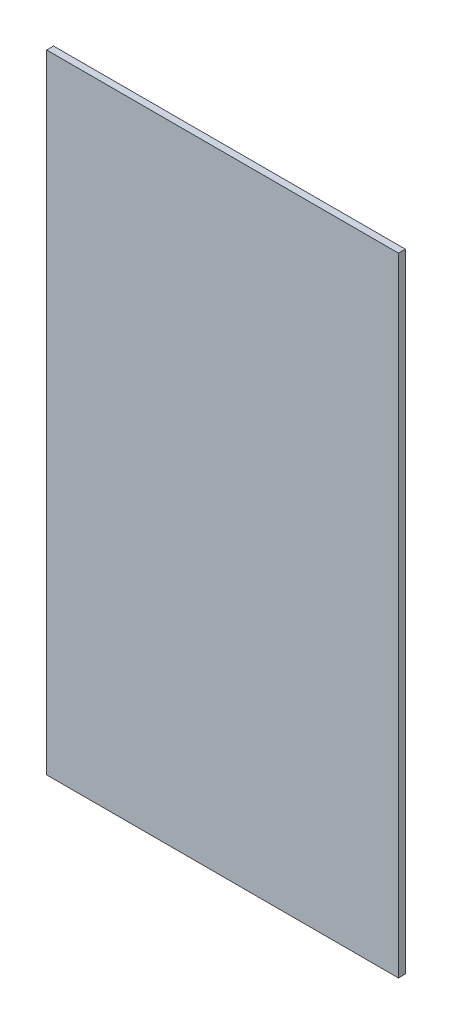
ISO-10303-21;
HEADER;
FILE_DESCRIPTION(('STEP AP214'),'2;1');
FILE_NAME('part.step','',(''),(''),'','','');
FILE_SCHEMA(('AUTOMOTIVE_DESIGN { 1 0 10303 214 1 1 1 1 }'));
ENDSEC;
DATA;
#1=APPLICATION_CONTEXT('core data for automotive mechanical design processes');
#2=APPLICATION_PROTOCOL_DEFINITION('international standard','automotive_design',2000,#1);
#3=PRODUCT_CONTEXT('',#1,'mechanical');
#4=PRODUCT('Part','Part','',(#3));
#5=PRODUCT_RELATED_PRODUCT_CATEGORY('part','',(#4));
#6=PRODUCT_DEFINITION_FORMATION('','',#4);
#7=PRODUCT_DEFINITION_CONTEXT('part definition',#1,'design');
#8=PRODUCT_DEFINITION('design','',#6,#7);
#9=PRODUCT_DEFINITION_SHAPE('','',#8);
#10=(LENGTH_UNIT() NAMED_UNIT(*) SI_UNIT(.MILLI.,.METRE.));
#11=(NAMED_UNIT(*) PLANE_ANGLE_UNIT() SI_UNIT($,.RADIAN.));
#12=(NAMED_UNIT(*) SI_UNIT($,.STERADIAN.) SOLID_ANGLE_UNIT());
#13=UNCERTAINTY_MEASURE_WITH_UNIT(LENGTH_MEASURE(1.E-05),#10,'distance_accuracy_value','');
#14=(GEOMETRIC_REPRESENTATION_CONTEXT(3) GLOBAL_UNCERTAINTY_ASSIGNED_CONTEXT((#13)) GLOBAL_UNIT_ASSIGNED_CONTEXT((#10,
#11,#12)) REPRESENTATION_CONTEXT('',''));
#15=CARTESIAN_POINT('',(0.,0.,0.));
#16=DIRECTION('',(0.,0.,1.));
#17=DIRECTION('',(1.,0.,0.));
#18=AXIS2_PLACEMENT_3D('',#15,#16,#17);
#19=CARTESIAN_POINT('',(22.5000000000001,22.5,-5.));
#20=DIRECTION('',(0.,-1.,0.));
#21=DIRECTION('',(1.,0.,0.));
#22=AXIS2_PLACEMENT_3D('',#19,#20,#21);
#23=PLANE('',#22);
#24=DIRECTION('',(1.,0.,0.));
#25=VECTOR('',#24,1.);
#26=CARTESIAN_POINT('',(22.5000000000001,22.5,0.));
#27=LINE('',#26,#25);
#28=CARTESIAN_POINT('',(22.5000000000001,22.5,0.));
#29=VERTEX_POINT('',#28);
#30=CARTESIAN_POINT('',(277.5,22.5000000000001,0.));
#31=VERTEX_POINT('',#30);
#32=EDGE_CURVE('E97',#29,#31,#27,.T.);
#33=ORIENTED_EDGE('',*,*,#32,.F.);
#34=DIRECTION('',(0.,0.,1.));
#35=VECTOR('',#34,1.);
#36=CARTESIAN_POINT('',(22.5000000000001,22.5,-5.));
#37=LINE('',#36,#35);
#38=CARTESIAN_POINT('',(22.5000000000001,22.5,-5.));
#39=VERTEX_POINT('',#38);
#40=EDGE_CURVE('E11',#39,#29,#37,.T.);
#41=ORIENTED_EDGE('',*,*,#40,.F.);
#42=DIRECTION('',(1.,0.,0.));
#43=VECTOR('',#42,1.);
#44=CARTESIAN_POINT('',(22.5000000000001,22.5,-5.));
#45=LINE('',#44,#43);
#46=CARTESIAN_POINT('',(277.5,22.5000000000001,-5.));
#47=VERTEX_POINT('',#46);
#48=EDGE_CURVE('E91',#39,#47,#45,.T.);
#49=ORIENTED_EDGE('',*,*,#48,.T.);
#50=DIRECTION('',(0.,0.,1.));
#51=VECTOR('',#50,1.);
#52=CARTESIAN_POINT('',(277.5,22.5000000000001,-5.));
#53=LINE('',#52,#51);
#54=EDGE_CURVE('E36',#47,#31,#53,.T.);
#55=ORIENTED_EDGE('',*,*,#54,.T.);
#56=EDGE_LOOP('',(#33,#41,#49,#55));
#57=FACE_BOUND('',#56,.T.);
#58=ADVANCED_FACE('F33',(#57),#23,.T.);
#59=CARTESIAN_POINT('',(22.5,477.5,-5.));
#60=DIRECTION('',(-1.,0.,0.));
#61=DIRECTION('',(0.,-1.,0.));
#62=AXIS2_PLACEMENT_3D('',#59,#60,#61);
#63=PLANE('',#62);
#64=DIRECTION('',(0.,-1.,0.));
#65=VECTOR('',#64,1.);
#66=CARTESIAN_POINT('',(22.5,477.5,0.));
#67=LINE('',#66,#65);
#68=CARTESIAN_POINT('',(22.5,477.5,0.));
#69=VERTEX_POINT('',#68);
#70=EDGE_CURVE('E93',#69,#29,#67,.T.);
#71=ORIENTED_EDGE('',*,*,#70,.F.);
#72=DIRECTION('',(0.,0.,1.));
#73=VECTOR('',#72,1.);
#74=CARTESIAN_POINT('',(22.5,477.5,-5.));
#75=LINE('',#74,#73);
#76=CARTESIAN_POINT('',(22.5,477.5,-5.));
#77=VERTEX_POINT('',#76);
#78=EDGE_CURVE('E42',#77,#69,#75,.T.);
#79=ORIENTED_EDGE('',*,*,#78,.F.);
#80=DIRECTION('',(0.,-1.,0.));
#81=VECTOR('',#80,1.);
#82=CARTESIAN_POINT('',(22.5,477.5,-5.));
#83=LINE('',#82,#81);
#84=EDGE_CURVE('E88',#77,#39,#83,.T.);
#85=ORIENTED_EDGE('',*,*,#84,.T.);
#86=ORIENTED_EDGE('',*,*,#40,.T.);
#87=EDGE_LOOP('',(#71,#79,#85,#86));
#88=FACE_BOUND('',#87,.T.);
#89=ADVANCED_FACE('F107',(#88),#63,.T.);
#90=CARTESIAN_POINT('',(277.5,477.5,-5.));
#91=DIRECTION('',(0.,1.,0.));
#92=DIRECTION('',(-1.,0.,0.));
#93=AXIS2_PLACEMENT_3D('',#90,#91,#92);
#94=PLANE('',#93);
#95=DIRECTION('',(-1.,0.,0.));
#96=VECTOR('',#95,1.);
#97=CARTESIAN_POINT('',(277.5,477.5,0.));
#98=LINE('',#97,#96);
#99=CARTESIAN_POINT('',(277.5,477.5,0.));
#100=VERTEX_POINT('',#99);
#101=EDGE_CURVE('E83',#100,#69,#98,.T.);
#102=ORIENTED_EDGE('',*,*,#101,.F.);
#103=DIRECTION('',(0.,0.,1.));
#104=VECTOR('',#103,1.);
#105=CARTESIAN_POINT('',(277.5,477.5,-5.));
#106=LINE('',#105,#104);
#107=CARTESIAN_POINT('',(277.5,477.5,-5.));
#108=VERTEX_POINT('',#107);
#109=EDGE_CURVE('E78',#108,#100,#106,.T.);
#110=ORIENTED_EDGE('',*,*,#109,.F.);
#111=DIRECTION('',(-1.,0.,0.));
#112=VECTOR('',#111,1.);
#113=CARTESIAN_POINT('',(277.5,477.5,-5.));
#114=LINE('',#113,#112);
#115=EDGE_CURVE('E81',#108,#77,#114,.T.);
#116=ORIENTED_EDGE('',*,*,#115,.T.);
#117=ORIENTED_EDGE('',*,*,#78,.T.);
#118=EDGE_LOOP('',(#102,#110,#116,#117));
#119=FACE_BOUND('',#118,.T.);
#120=ADVANCED_FACE('F80',(#119),#94,.T.);
#121=CARTESIAN_POINT('',(277.5,22.5000000000001,-5.));
#122=DIRECTION('',(1.,0.,0.));
#123=DIRECTION('',(0.,1.,0.));
#124=AXIS2_PLACEMENT_3D('',#121,#122,#123);
#125=PLANE('',#124);
#126=DIRECTION('',(0.,1.,0.));
#127=VECTOR('',#126,1.);
#128=CARTESIAN_POINT('',(277.5,22.5000000000001,0.));
#129=LINE('',#128,#127);
#130=EDGE_CURVE('E100',#31,#100,#129,.T.);
#131=ORIENTED_EDGE('',*,*,#130,.F.);
#132=ORIENTED_EDGE('',*,*,#54,.F.);
#133=DIRECTION('',(0.,1.,0.));
#134=VECTOR('',#133,1.);
#135=CARTESIAN_POINT('',(277.5,22.5000000000001,-5.));
#136=LINE('',#135,#134);
#137=EDGE_CURVE('E87',#47,#108,#136,.T.);
#138=ORIENTED_EDGE('',*,*,#137,.T.);
#139=ORIENTED_EDGE('',*,*,#109,.T.);
#140=EDGE_LOOP('',(#131,#132,#138,#139));
#141=FACE_BOUND('',#140,.T.);
#142=ADVANCED_FACE('F90',(#141),#125,.T.);
#143=CARTESIAN_POINT('',(0.,0.,-5.));
#144=DIRECTION('',(0.,0.,1.));
#145=DIRECTION('',(1.,0.,0.));
#146=AXIS2_PLACEMENT_3D('',#143,#144,#145);
#147=PLANE('',#146);
#148=ORIENTED_EDGE('',*,*,#48,.F.);
#149=ORIENTED_EDGE('',*,*,#84,.F.);
#150=ORIENTED_EDGE('',*,*,#115,.F.);
#151=ORIENTED_EDGE('',*,*,#137,.F.);
#152=EDGE_LOOP('',(#148,#149,#150,#151));
#153=FACE_BOUND('',#152,.T.);
#154=ADVANCED_FACE('F86',(#153),#147,.F.);
#155=CARTESIAN_POINT('',(0.,0.,0.));
#156=DIRECTION('',(0.,0.,1.));
#157=DIRECTION('',(1.,0.,0.));
#158=AXIS2_PLACEMENT_3D('',#155,#156,#157);
#159=PLANE('',#158);
#160=ORIENTED_EDGE('',*,*,#32,.T.);
#161=ORIENTED_EDGE('',*,*,#130,.T.);
#162=ORIENTED_EDGE('',*,*,#101,.T.);
#163=ORIENTED_EDGE('',*,*,#70,.T.);
#164=EDGE_LOOP('',(#160,#161,#162,#163));
#165=FACE_BOUND('',#164,.T.);
#166=ADVANCED_FACE('F106',(#165),#159,.T.);
#167=CLOSED_SHELL('',(#58,#89,#120,#142,#154,#166));
#168=MANIFOLD_SOLID_BREP('B2',#167);
#169=ADVANCED_BREP_SHAPE_REPRESENTATION('',(#18,#168),#14);
#170=SHAPE_DEFINITION_REPRESENTATION(#9,#169);
ENDSEC;
END-ISO-10303-21;
